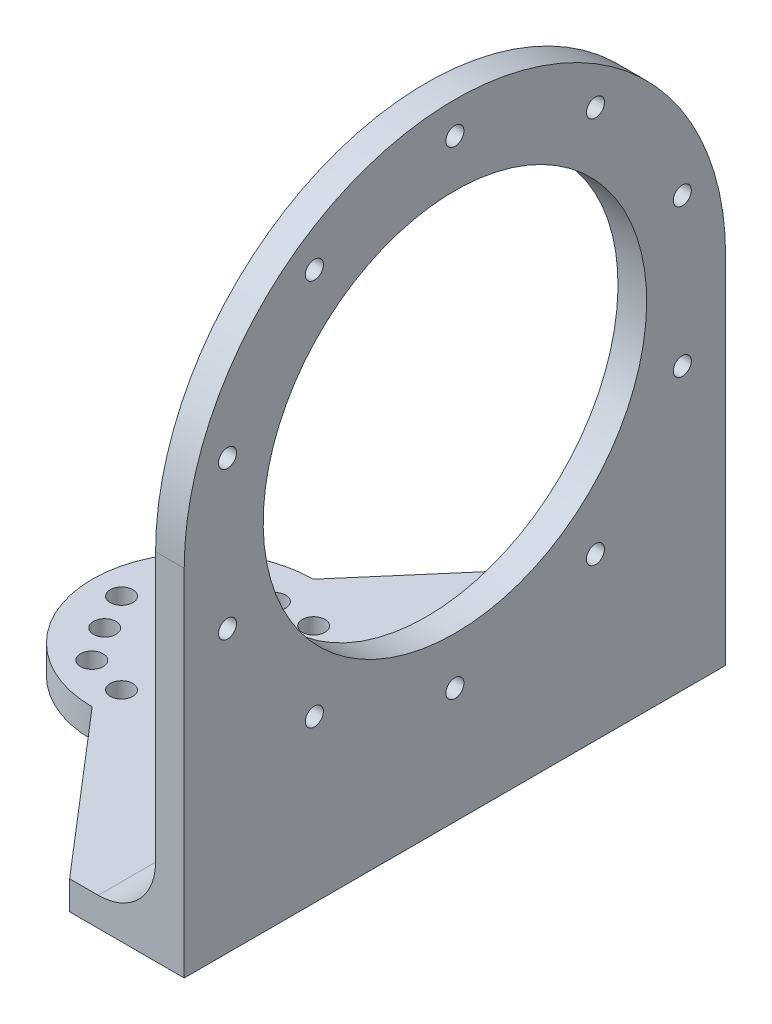
ISO-10303-21;
HEADER;
FILE_DESCRIPTION(('STEP AP214'),'2;1');
FILE_NAME('part.step','',(''),(''),'','','');
FILE_SCHEMA(('AUTOMOTIVE_DESIGN { 1 0 10303 214 1 1 1 1 }'));
ENDSEC;
DATA;
#1=APPLICATION_CONTEXT('core data for automotive mechanical design processes');
#2=APPLICATION_PROTOCOL_DEFINITION('international standard','automotive_design',2000,#1);
#3=PRODUCT_CONTEXT('',#1,'mechanical');
#4=PRODUCT('Part','Part','',(#3));
#5=PRODUCT_RELATED_PRODUCT_CATEGORY('part','',(#4));
#6=PRODUCT_DEFINITION_FORMATION('','',#4);
#7=PRODUCT_DEFINITION_CONTEXT('part definition',#1,'design');
#8=PRODUCT_DEFINITION('design','',#6,#7);
#9=PRODUCT_DEFINITION_SHAPE('','',#8);
#10=(LENGTH_UNIT() NAMED_UNIT(*) SI_UNIT(.MILLI.,.METRE.));
#11=(NAMED_UNIT(*) PLANE_ANGLE_UNIT() SI_UNIT($,.RADIAN.));
#12=(NAMED_UNIT(*) SI_UNIT($,.STERADIAN.) SOLID_ANGLE_UNIT());
#13=UNCERTAINTY_MEASURE_WITH_UNIT(LENGTH_MEASURE(1.E-05),#10,'distance_accuracy_value','');
#14=(GEOMETRIC_REPRESENTATION_CONTEXT(3) GLOBAL_UNCERTAINTY_ASSIGNED_CONTEXT((#13)) GLOBAL_UNIT_ASSIGNED_CONTEXT((#10,
#11,#12)) REPRESENTATION_CONTEXT('',''));
#15=CARTESIAN_POINT('',(0.,0.,0.));
#16=DIRECTION('',(0.,0.,1.));
#17=DIRECTION('',(1.,0.,0.));
#18=AXIS2_PLACEMENT_3D('',#15,#16,#17);
#19=CARTESIAN_POINT('',(47.625,73.025,120.));
#20=DIRECTION('',(0.,0.,-1.));
#21=DIRECTION('',(-1.,0.,0.));
#22=AXIS2_PLACEMENT_3D('',#19,#20,#21);
#23=PLANE('',#22);
#24=DIRECTION('',(-1.,0.,0.));
#25=VECTOR('',#24,1.);
#26=CARTESIAN_POINT('',(191.651206952585,2.45000000000006,120.));
#27=LINE('',#26,#25);
#28=CARTESIAN_POINT('',(50.8,2.45000000000005,120.));
#29=VERTEX_POINT('',#28);
#30=CARTESIAN_POINT('',(44.45,2.45000000000004,120.));
#31=VERTEX_POINT('',#30);
#32=EDGE_CURVE('E121',#29,#31,#27,.T.);
#33=ORIENTED_EDGE('',*,*,#32,.T.);
#34=DIRECTION('',(0.,-1.,0.));
#35=VECTOR('',#34,1.);
#36=CARTESIAN_POINT('',(44.45,73.025,120.));
#37=LINE('',#36,#35);
#38=CARTESIAN_POINT('',(44.45,-57.15,120.));
#39=VERTEX_POINT('',#38);
#40=EDGE_CURVE('E129',#31,#39,#37,.T.);
#41=ORIENTED_EDGE('',*,*,#40,.T.);
#42=CARTESIAN_POINT('',(31.75,-57.15,120.));
#43=DIRECTION('',(0.,0.,-1.));
#44=DIRECTION('',(-1.,0.,0.));
#45=AXIS2_PLACEMENT_3D('',#42,#43,#44);
#46=CIRCLE('',#45,12.7);
#47=CARTESIAN_POINT('',(31.75,-69.85,120.));
#48=VERTEX_POINT('',#47);
#49=EDGE_CURVE('E153',#39,#48,#46,.T.);
#50=ORIENTED_EDGE('',*,*,#49,.T.);
#51=DIRECTION('',(-1.,0.,0.));
#52=VECTOR('',#51,1.);
#53=CARTESIAN_POINT('',(31.75,-69.85,120.));
#54=LINE('',#53,#52);
#55=CARTESIAN_POINT('',(25.4,-69.85,120.));
#56=VERTEX_POINT('',#55);
#57=EDGE_CURVE('E148',#48,#56,#54,.T.);
#58=ORIENTED_EDGE('',*,*,#57,.T.);
#59=DIRECTION('',(0.,1.,0.));
#60=VECTOR('',#59,1.);
#61=CARTESIAN_POINT('',(25.4,-218.349358071009,120.));
#62=LINE('',#61,#60);
#63=CARTESIAN_POINT('',(25.4,-76.2,120.));
#64=VERTEX_POINT('',#63);
#65=EDGE_CURVE('E182',#64,#56,#62,.T.);
#66=ORIENTED_EDGE('',*,*,#65,.F.);
#67=DIRECTION('',(1.,0.,0.));
#68=VECTOR('',#67,1.);
#69=CARTESIAN_POINT('',(-50.8,-76.2,120.));
#70=LINE('',#69,#68);
#71=CARTESIAN_POINT('',(50.8,-76.2,120.));
#72=VERTEX_POINT('',#71);
#73=EDGE_CURVE('E145',#64,#72,#70,.T.);
#74=ORIENTED_EDGE('',*,*,#73,.T.);
#75=DIRECTION('',(0.,1.,0.));
#76=VECTOR('',#75,1.);
#77=CARTESIAN_POINT('',(50.8,-76.2,120.));
#78=LINE('',#77,#76);
#79=EDGE_CURVE('E159',#72,#29,#78,.T.);
#80=ORIENTED_EDGE('',*,*,#79,.T.);
#81=EDGE_LOOP('',(#33,#41,#50,#58,#66,#74,#80));
#82=FACE_BOUND('',#81,.T.);
#83=ADVANCED_FACE('F44',(#82),#23,.F.);
#84=CARTESIAN_POINT('',(47.625,73.025,0.));
#85=DIRECTION('',(0.,0.,-1.));
#86=DIRECTION('',(-1.,0.,0.));
#87=AXIS2_PLACEMENT_3D('',#84,#85,#86);
#88=PLANE('',#87);
#89=DIRECTION('',(0.,-1.,0.));
#90=VECTOR('',#89,1.);
#91=CARTESIAN_POINT('',(44.45,73.025,0.));
#92=LINE('',#91,#90);
#93=CARTESIAN_POINT('',(44.45,2.45000000000004,0.));
#94=VERTEX_POINT('',#93);
#95=CARTESIAN_POINT('',(44.45,-57.15,0.));
#96=VERTEX_POINT('',#95);
#97=EDGE_CURVE('E127',#94,#96,#92,.T.);
#98=ORIENTED_EDGE('',*,*,#97,.F.);
#99=DIRECTION('',(-1.,0.,0.));
#100=VECTOR('',#99,1.);
#101=CARTESIAN_POINT('',(191.651206952585,2.45000000000007,0.));
#102=LINE('',#101,#100);
#103=CARTESIAN_POINT('',(50.8,2.45000000000005,0.));
#104=VERTEX_POINT('',#103);
#105=EDGE_CURVE('E112',#104,#94,#102,.T.);
#106=ORIENTED_EDGE('',*,*,#105,.F.);
#107=DIRECTION('',(0.,1.,0.));
#108=VECTOR('',#107,1.);
#109=CARTESIAN_POINT('',(50.8,-76.2,0.));
#110=LINE('',#109,#108);
#111=CARTESIAN_POINT('',(50.8,-76.2,0.));
#112=VERTEX_POINT('',#111);
#113=EDGE_CURVE('E135',#112,#104,#110,.T.);
#114=ORIENTED_EDGE('',*,*,#113,.F.);
#115=DIRECTION('',(1.,0.,0.));
#116=VECTOR('',#115,1.);
#117=CARTESIAN_POINT('',(-50.8,-76.2,0.));
#118=LINE('',#117,#116);
#119=CARTESIAN_POINT('',(25.4,-76.2,0.));
#120=VERTEX_POINT('',#119);
#121=EDGE_CURVE('E139',#120,#112,#118,.T.);
#122=ORIENTED_EDGE('',*,*,#121,.F.);
#123=DIRECTION('',(0.,1.,0.));
#124=VECTOR('',#123,1.);
#125=CARTESIAN_POINT('',(25.4,-218.349358071009,0.));
#126=LINE('',#125,#124);
#127=CARTESIAN_POINT('',(25.4,-69.85,0.));
#128=VERTEX_POINT('',#127);
#129=EDGE_CURVE('E183',#120,#128,#126,.T.);
#130=ORIENTED_EDGE('',*,*,#129,.T.);
#131=DIRECTION('',(-1.,0.,0.));
#132=VECTOR('',#131,1.);
#133=CARTESIAN_POINT('',(31.75,-69.85,0.));
#134=LINE('',#133,#132);
#135=CARTESIAN_POINT('',(31.75,-69.85,0.));
#136=VERTEX_POINT('',#135);
#137=EDGE_CURVE('E137',#136,#128,#134,.T.);
#138=ORIENTED_EDGE('',*,*,#137,.F.);
#139=CARTESIAN_POINT('',(31.75,-57.15,0.));
#140=DIRECTION('',(0.,0.,-1.));
#141=DIRECTION('',(-1.,0.,0.));
#142=AXIS2_PLACEMENT_3D('',#139,#140,#141);
#143=CIRCLE('',#142,12.7);
#144=EDGE_CURVE('E134',#96,#136,#143,.T.);
#145=ORIENTED_EDGE('',*,*,#144,.F.);
#146=EDGE_LOOP('',(#98,#106,#114,#122,#130,#138,#145));
#147=FACE_BOUND('',#146,.T.);
#148=ADVANCED_FACE('F132',(#147),#88,.T.);
#149=CARTESIAN_POINT('',(-50.8,-76.2,120.));
#150=DIRECTION('',(0.,1.,0.));
#151=DIRECTION('',(-1.,0.,0.));
#152=AXIS2_PLACEMENT_3D('',#149,#150,#151);
#153=PLANE('',#152);
#154=CARTESIAN_POINT('',(-14.0999999999991,-76.2,75.5884572681215));
#155=DIRECTION('',(0.,1.,0.));
#156=DIRECTION('',(-1.,0.,0.));
#157=AXIS2_PLACEMENT_3D('',#154,#155,#156);
#158=CIRCLE('',#157,2.50000000000047);
#159=CARTESIAN_POINT('',(-16.5999999999996,-76.2,75.5884572681215));
#160=VERTEX_POINT('',#159);
#161=EDGE_CURVE('E273',#160,#160,#158,.F.);
#162=ORIENTED_EDGE('',*,*,#161,.F.);
#163=EDGE_LOOP('',(#162));
#164=FACE_BOUND('',#163,.T.);
#165=CARTESIAN_POINT('',(-5.0999999999987,-76.2,78.0000000000009));
#166=DIRECTION('',(0.,1.,0.));
#167=DIRECTION('',(-1.,0.,0.));
#168=AXIS2_PLACEMENT_3D('',#165,#166,#167);
#169=CIRCLE('',#168,2.50000000000032);
#170=CARTESIAN_POINT('',(-7.59999999999901,-76.2,78.0000000000009));
#171=VERTEX_POINT('',#170);
#172=EDGE_CURVE('E298',#171,#171,#169,.F.);
#173=ORIENTED_EDGE('',*,*,#172,.F.);
#174=EDGE_LOOP('',(#173));
#175=FACE_BOUND('',#174,.T.);
#176=CARTESIAN_POINT('',(3.90000000000132,-76.2,75.5884572681199));
#177=DIRECTION('',(0.,1.,0.));
#178=DIRECTION('',(-1.,0.,0.));
#179=AXIS2_PLACEMENT_3D('',#176,#177,#178);
#180=CIRCLE('',#179,2.50000000000035);
#181=CARTESIAN_POINT('',(1.40000000000097,-76.2,75.5884572681199));
#182=VERTEX_POINT('',#181);
#183=EDGE_CURVE('E292',#182,#182,#180,.F.);
#184=ORIENTED_EDGE('',*,*,#183,.F.);
#185=EDGE_LOOP('',(#184));
#186=FACE_BOUND('',#185,.T.);
#187=CARTESIAN_POINT('',(12.9000000000016,-76.2,59.9999999999997));
#188=DIRECTION('',(0.,1.,0.));
#189=DIRECTION('',(-1.,0.,0.));
#190=AXIS2_PLACEMENT_3D('',#187,#188,#189);
#191=CIRCLE('',#190,2.49999999999915);
#192=CARTESIAN_POINT('',(10.4000000000024,-76.2,59.9999999999997));
#193=VERTEX_POINT('',#192);
#194=EDGE_CURVE('E284',#193,#193,#191,.F.);
#195=ORIENTED_EDGE('',*,*,#194,.F.);
#196=EDGE_LOOP('',(#195));
#197=FACE_BOUND('',#196,.T.);
#198=CARTESIAN_POINT('',(3.90000000000003,-76.2,44.4115427318801));
#199=DIRECTION('',(0.,1.,0.));
#200=DIRECTION('',(-1.,0.,0.));
#201=AXIS2_PLACEMENT_3D('',#198,#199,#200);
#202=CIRCLE('',#201,2.5);
#203=CARTESIAN_POINT('',(1.40000000000003,-76.2,44.4115427318801));
#204=VERTEX_POINT('',#203);
#205=EDGE_CURVE('E320',#204,#204,#202,.F.);
#206=ORIENTED_EDGE('',*,*,#205,.F.);
#207=EDGE_LOOP('',(#206));
#208=FACE_BOUND('',#207,.T.);
#209=CARTESIAN_POINT('',(8.66980392017361,-76.2,67.9499999999994));
#210=DIRECTION('',(0.,1.,0.));
#211=DIRECTION('',(-1.,0.,0.));
#212=AXIS2_PLACEMENT_3D('',#209,#210,#211);
#213=CIRCLE('',#212,2.50000000000089);
#214=CARTESIAN_POINT('',(6.16980392017272,-76.2,67.9499999999994));
#215=VERTEX_POINT('',#214);
#216=EDGE_CURVE('E315',#215,#215,#213,.F.);
#217=ORIENTED_EDGE('',*,*,#216,.F.);
#218=EDGE_LOOP('',(#217));
#219=FACE_BOUND('',#218,.T.);
#220=CARTESIAN_POINT('',(-18.8698039201716,-76.2,67.9500000000006));
#221=DIRECTION('',(0.,1.,0.));
#222=DIRECTION('',(-1.,0.,0.));
#223=AXIS2_PLACEMENT_3D('',#220,#221,#222);
#224=CIRCLE('',#223,2.50000000000128);
#225=CARTESIAN_POINT('',(-21.3698039201728,-76.2,67.9500000000006));
#226=VERTEX_POINT('',#225);
#227=EDGE_CURVE('E308',#226,#226,#224,.F.);
#228=ORIENTED_EDGE('',*,*,#227,.F.);
#229=EDGE_LOOP('',(#228));
#230=FACE_BOUND('',#229,.T.);
#231=CARTESIAN_POINT('',(10.4884572681207,-76.2,50.9999999999996));
#232=DIRECTION('',(0.,1.,0.));
#233=DIRECTION('',(-1.,0.,0.));
#234=AXIS2_PLACEMENT_3D('',#231,#232,#233);
#235=CIRCLE('',#234,2.49999999999935);
#236=CARTESIAN_POINT('',(7.98845726812136,-76.2,50.9999999999996));
#237=VERTEX_POINT('',#236);
#238=EDGE_CURVE('E291',#237,#237,#235,.F.);
#239=ORIENTED_EDGE('',*,*,#238,.F.);
#240=EDGE_LOOP('',(#239));
#241=FACE_BOUND('',#240,.T.);
#242=CARTESIAN_POINT('',(-23.0999999999993,-76.2,60.0000000000012));
#243=DIRECTION('',(0.,1.,0.));
#244=DIRECTION('',(-1.,0.,0.));
#245=AXIS2_PLACEMENT_3D('',#242,#243,#244);
#246=CIRCLE('',#245,2.50000000000138);
#247=CARTESIAN_POINT('',(-25.6000000000007,-76.2,60.0000000000012));
#248=VERTEX_POINT('',#247);
#249=EDGE_CURVE('E266',#248,#248,#246,.F.);
#250=ORIENTED_EDGE('',*,*,#249,.F.);
#251=EDGE_LOOP('',(#250));
#252=FACE_BOUND('',#251,.T.);
#253=CARTESIAN_POINT('',(-20.68845726812,-76.2,51.0000000000007));
#254=DIRECTION('',(0.,1.,0.));
#255=DIRECTION('',(-1.,0.,0.));
#256=AXIS2_PLACEMENT_3D('',#253,#254,#255);
#257=CIRCLE('',#256,2.50000000000075);
#258=CARTESIAN_POINT('',(-23.1884572681207,-76.2,51.0000000000007));
#259=VERTEX_POINT('',#258);
#260=EDGE_CURVE('E274',#259,#259,#257,.F.);
#261=ORIENTED_EDGE('',*,*,#260,.F.);
#262=EDGE_LOOP('',(#261));
#263=FACE_BOUND('',#262,.T.);
#264=CARTESIAN_POINT('',(-14.1000000000004,-76.2,44.4115427318801));
#265=DIRECTION('',(0.,1.,0.));
#266=DIRECTION('',(-1.,0.,0.));
#267=AXIS2_PLACEMENT_3D('',#264,#265,#266);
#268=CIRCLE('',#267,2.50000000000025);
#269=CARTESIAN_POINT('',(-16.6000000000007,-76.2,44.4115427318801));
#270=VERTEX_POINT('',#269);
#271=EDGE_CURVE('E265',#270,#270,#268,.F.);
#272=ORIENTED_EDGE('',*,*,#271,.F.);
#273=EDGE_LOOP('',(#272));
#274=FACE_BOUND('',#273,.T.);
#275=CARTESIAN_POINT('',(-5.09999999999999,-76.2,44.1));
#276=DIRECTION('',(0.,1.,0.));
#277=DIRECTION('',(-1.,0.,0.));
#278=AXIS2_PLACEMENT_3D('',#275,#276,#277);
#279=CIRCLE('',#278,2.5);
#280=CARTESIAN_POINT('',(-7.59999999999999,-76.2,44.1));
#281=VERTEX_POINT('',#280);
#282=EDGE_CURVE('E178',#281,#281,#279,.F.);
#283=ORIENTED_EDGE('',*,*,#282,.F.);
#284=EDGE_LOOP('',(#283));
#285=FACE_BOUND('',#284,.T.);
#286=CARTESIAN_POINT('',(-5.09999999999999,-76.2,60.));
#287=DIRECTION('',(0.,1.,0.));
#288=DIRECTION('',(-1.,0.,0.));
#289=AXIS2_PLACEMENT_3D('',#286,#287,#288);
#290=CIRCLE('',#289,24.5);
#291=CARTESIAN_POINT('',(-5.1,-76.2,35.5));
#292=VERTEX_POINT('',#291);
#293=CARTESIAN_POINT('',(-5.09999999999998,-76.2,84.5));
#294=VERTEX_POINT('',#293);
#295=EDGE_CURVE('E167',#292,#294,#290,.T.);
#296=ORIENTED_EDGE('',*,*,#295,.F.);
#297=DIRECTION('',(-0.651670723445816,0.,0.758501989584475));
#298=VECTOR('',#297,1.);
#299=CARTESIAN_POINT('',(-5.1,-76.2,35.5));
#300=LINE('',#299,#298);
#301=EDGE_CURVE('E162',#120,#292,#300,.T.);
#302=ORIENTED_EDGE('',*,*,#301,.F.);
#303=ORIENTED_EDGE('',*,*,#121,.T.);
#304=DIRECTION('',(0.,0.,-1.));
#305=VECTOR('',#304,1.);
#306=CARTESIAN_POINT('',(50.8,-76.2,120.));
#307=LINE('',#306,#305);
#308=EDGE_CURVE('E11',#72,#112,#307,.T.);
#309=ORIENTED_EDGE('',*,*,#308,.F.);
#310=ORIENTED_EDGE('',*,*,#73,.F.);
#311=DIRECTION('',(0.651670723445816,0.,0.758501989584475));
#312=VECTOR('',#311,1.);
#313=CARTESIAN_POINT('',(25.4,-76.2,120.));
#314=LINE('',#313,#312);
#315=EDGE_CURVE('E170',#294,#64,#314,.T.);
#316=ORIENTED_EDGE('',*,*,#315,.F.);
#317=EDGE_LOOP('',(#296,#302,#303,#309,#310,#316));
#318=FACE_BOUND('',#317,.T.);
#319=ADVANCED_FACE('F46',(#164,#175,#186,#197,#208,#219,#230,#241,#252,#263,#274,#285,#318),
#153,.F.);
#320=CARTESIAN_POINT('',(50.8,-76.2,120.));
#321=DIRECTION('',(-1.,0.,0.));
#322=DIRECTION('',(0.,-1.,0.));
#323=AXIS2_PLACEMENT_3D('',#320,#321,#322);
#324=PLANE('',#323);
#325=CARTESIAN_POINT('',(50.8,-13.9279007018952,9.59400463638843));
#326=DIRECTION('',(-1.,0.,0.));
#327=DIRECTION('',(0.,-1.,0.));
#328=AXIS2_PLACEMENT_3D('',#325,#326,#327);
#329=CIRCLE('',#328,2.);
#330=CARTESIAN_POINT('',(50.8,-15.9279007018952,9.59400463638843));
#331=VERTEX_POINT('',#330);
#332=EDGE_CURVE('E208',#331,#331,#329,.F.);
#333=ORIENTED_EDGE('',*,*,#332,.F.);
#334=EDGE_LOOP('',(#333));
#335=FACE_BOUND('',#334,.T.);
#336=CARTESIAN_POINT('',(50.8,-40.4279007018864,28.8473816285426));
#337=DIRECTION('',(-1.,0.,0.));
#338=DIRECTION('',(0.,-1.,0.));
#339=AXIS2_PLACEMENT_3D('',#336,#337,#338);
#340=CIRCLE('',#339,2.);
#341=CARTESIAN_POINT('',(50.8,-42.4279007018864,28.8473816285426));
#342=VERTEX_POINT('',#341);
#343=EDGE_CURVE('E226',#342,#342,#340,.F.);
#344=ORIENTED_EDGE('',*,*,#343,.F.);
#345=EDGE_LOOP('',(#344));
#346=FACE_BOUND('',#345,.T.);
#347=CARTESIAN_POINT('',(50.8,-50.5499999999999,60.0000000000483));
#348=DIRECTION('',(-1.,0.,0.));
#349=DIRECTION('',(0.,-1.,0.));
#350=AXIS2_PLACEMENT_3D('',#347,#348,#349);
#351=CIRCLE('',#350,2.);
#352=CARTESIAN_POINT('',(50.8,-52.5499999999999,60.0000000000483));
#353=VERTEX_POINT('',#352);
#354=EDGE_CURVE('E220',#353,#353,#351,.F.);
#355=ORIENTED_EDGE('',*,*,#354,.F.);
#356=EDGE_LOOP('',(#355));
#357=FACE_BOUND('',#356,.T.);
#358=CARTESIAN_POINT('',(50.8,-40.4279007018579,91.1526183715447));
#359=DIRECTION('',(-1.,0.,0.));
#360=DIRECTION('',(0.,-1.,0.));
#361=AXIS2_PLACEMENT_3D('',#358,#359,#360);
#362=CIRCLE('',#361,2.00000000000004);
#363=CARTESIAN_POINT('',(50.8,-42.427900701858,91.1526183715447));
#364=VERTEX_POINT('',#363);
#365=EDGE_CURVE('E212',#364,#364,#362,.F.);
#366=ORIENTED_EDGE('',*,*,#365,.F.);
#367=EDGE_LOOP('',(#366));
#368=FACE_BOUND('',#367,.T.);
#369=CARTESIAN_POINT('',(50.8,-13.9279007018492,110.405995363675));
#370=DIRECTION('',(-1.,0.,0.));
#371=DIRECTION('',(0.,-1.,0.));
#372=AXIS2_PLACEMENT_3D('',#369,#370,#371);
#373=CIRCLE('',#372,2.);
#374=CARTESIAN_POINT('',(50.8,-15.9279007018492,110.405995363675));
#375=VERTEX_POINT('',#374);
#376=EDGE_CURVE('E219',#375,#375,#373,.F.);
#377=ORIENTED_EDGE('',*,*,#376,.F.);
#378=EDGE_LOOP('',(#377));
#379=FACE_BOUND('',#378,.T.);
#380=CARTESIAN_POINT('',(50.8,18.8279007018953,110.40599536366));
#381=DIRECTION('',(-1.,0.,0.));
#382=DIRECTION('',(0.,-1.,0.));
#383=AXIS2_PLACEMENT_3D('',#380,#381,#382);
#384=CIRCLE('',#383,2.);
#385=CARTESIAN_POINT('',(50.8,16.8279007018953,110.40599536366));
#386=VERTEX_POINT('',#385);
#387=EDGE_CURVE('E250',#386,#386,#384,.F.);
#388=ORIENTED_EDGE('',*,*,#387,.F.);
#389=EDGE_LOOP('',(#388));
#390=FACE_BOUND('',#389,.T.);
#391=CARTESIAN_POINT('',(50.8,45.3279007018864,91.1526183715056));
#392=DIRECTION('',(-1.,0.,0.));
#393=DIRECTION('',(0.,-1.,0.));
#394=AXIS2_PLACEMENT_3D('',#391,#392,#393);
#395=CIRCLE('',#394,2.);
#396=CARTESIAN_POINT('',(50.8,43.3279007018865,91.1526183715056));
#397=VERTEX_POINT('',#396);
#398=EDGE_CURVE('E244',#397,#397,#395,.F.);
#399=ORIENTED_EDGE('',*,*,#398,.F.);
#400=EDGE_LOOP('',(#399));
#401=FACE_BOUND('',#400,.T.);
#402=CARTESIAN_POINT('',(50.8,55.45,59.9999999999999));
#403=DIRECTION('',(-1.,0.,0.));
#404=DIRECTION('',(0.,-1.,0.));
#405=AXIS2_PLACEMENT_3D('',#402,#403,#404);
#406=CIRCLE('',#405,2.);
#407=CARTESIAN_POINT('',(50.8,53.4500000000001,59.9999999999999));
#408=VERTEX_POINT('',#407);
#409=EDGE_CURVE('E236',#408,#408,#406,.F.);
#410=ORIENTED_EDGE('',*,*,#409,.F.);
#411=EDGE_LOOP('',(#410));
#412=FACE_BOUND('',#411,.T.);
#413=CARTESIAN_POINT('',(50.8,18.8279007018492,9.59400463637344));
#414=DIRECTION('',(-1.,0.,0.));
#415=DIRECTION('',(0.,-1.,0.));
#416=AXIS2_PLACEMENT_3D('',#413,#414,#415);
#417=CIRCLE('',#416,2.00000000000005);
#418=CARTESIAN_POINT('',(50.8,16.8279007018492,9.59400463637344));
#419=VERTEX_POINT('',#418);
#420=EDGE_CURVE('E203',#419,#419,#417,.F.);
#421=ORIENTED_EDGE('',*,*,#420,.F.);
#422=EDGE_LOOP('',(#421));
#423=FACE_BOUND('',#422,.T.);
#424=CARTESIAN_POINT('',(50.8,45.327900701858,28.8473816285034));
#425=DIRECTION('',(-1.,0.,0.));
#426=DIRECTION('',(0.,-1.,0.));
#427=AXIS2_PLACEMENT_3D('',#424,#425,#426);
#428=CIRCLE('',#427,2.);
#429=CARTESIAN_POINT('',(50.8,43.327900701858,28.8473816285034));
#430=VERTEX_POINT('',#429);
#431=EDGE_CURVE('E196',#430,#430,#428,.F.);
#432=ORIENTED_EDGE('',*,*,#431,.F.);
#433=EDGE_LOOP('',(#432));
#434=FACE_BOUND('',#433,.T.);
#435=CARTESIAN_POINT('',(50.8,2.45000000000004,59.9999999999999));
#436=DIRECTION('',(-1.,0.,0.));
#437=DIRECTION('',(0.,-1.,0.));
#438=AXIS2_PLACEMENT_3D('',#435,#436,#437);
#439=CIRCLE('',#438,42.5);
#440=CARTESIAN_POINT('',(50.8,-40.05,59.9999999999999));
#441=VERTEX_POINT('',#440);
#442=EDGE_CURVE('E262',#441,#441,#439,.F.);
#443=ORIENTED_EDGE('',*,*,#442,.F.);
#444=EDGE_LOOP('',(#443));
#445=FACE_BOUND('',#444,.T.);
#446=ORIENTED_EDGE('',*,*,#113,.T.);
#447=CARTESIAN_POINT('',(50.8,2.45000000000004,59.9999999999999));
#448=DIRECTION('',(-1.,0.,0.));
#449=DIRECTION('',(0.,-1.,0.));
#450=AXIS2_PLACEMENT_3D('',#447,#448,#449);
#451=CIRCLE('',#450,60.);
#452=EDGE_CURVE('E59',#29,#104,#451,.T.);
#453=ORIENTED_EDGE('',*,*,#452,.F.);
#454=ORIENTED_EDGE('',*,*,#79,.F.);
#455=ORIENTED_EDGE('',*,*,#308,.T.);
#456=EDGE_LOOP('',(#446,#453,#454,#455));
#457=FACE_BOUND('',#456,.T.);
#458=ADVANCED_FACE('F195',(#335,#346,#357,#368,#379,#390,#401,#412,#423,#434,#445,#457),#324,.F.);
#459=CARTESIAN_POINT('',(44.45,73.025,120.));
#460=DIRECTION('',(1.,0.,0.));
#461=DIRECTION('',(0.,1.,0.));
#462=AXIS2_PLACEMENT_3D('',#459,#460,#461);
#463=PLANE('',#462);
#464=CARTESIAN_POINT('',(44.45,-13.9279007018952,9.59400463638843));
#465=DIRECTION('',(-1.,0.,0.));
#466=DIRECTION('',(0.,-1.,0.));
#467=AXIS2_PLACEMENT_3D('',#464,#465,#466);
#468=CIRCLE('',#467,2.);
#469=CARTESIAN_POINT('',(44.45,-15.9279007018952,9.59400463638843));
#470=VERTEX_POINT('',#469);
#471=EDGE_CURVE('E229',#470,#470,#468,.T.);
#472=ORIENTED_EDGE('',*,*,#471,.F.);
#473=EDGE_LOOP('',(#472));
#474=FACE_BOUND('',#473,.T.);
#475=CARTESIAN_POINT('',(44.45,-40.4279007018864,28.8473816285426));
#476=DIRECTION('',(-1.,0.,0.));
#477=DIRECTION('',(0.,-1.,0.));
#478=AXIS2_PLACEMENT_3D('',#475,#476,#477);
#479=CIRCLE('',#478,2.);
#480=CARTESIAN_POINT('',(44.45,-42.4279007018864,28.8473816285426));
#481=VERTEX_POINT('',#480);
#482=EDGE_CURVE('E223',#481,#481,#479,.T.);
#483=ORIENTED_EDGE('',*,*,#482,.F.);
#484=EDGE_LOOP('',(#483));
#485=FACE_BOUND('',#484,.T.);
#486=CARTESIAN_POINT('',(44.45,-50.5499999999999,60.0000000000483));
#487=DIRECTION('',(-1.,0.,0.));
#488=DIRECTION('',(0.,-1.,0.));
#489=AXIS2_PLACEMENT_3D('',#486,#487,#488);
#490=CIRCLE('',#489,2.);
#491=CARTESIAN_POINT('',(44.45,-52.5499999999999,60.0000000000483));
#492=VERTEX_POINT('',#491);
#493=EDGE_CURVE('E216',#492,#492,#490,.T.);
#494=ORIENTED_EDGE('',*,*,#493,.F.);
#495=EDGE_LOOP('',(#494));
#496=FACE_BOUND('',#495,.T.);
#497=CARTESIAN_POINT('',(44.45,-40.4279007018579,91.1526183715447));
#498=DIRECTION('',(-1.,0.,0.));
#499=DIRECTION('',(0.,-1.,0.));
#500=AXIS2_PLACEMENT_3D('',#497,#498,#499);
#501=CIRCLE('',#500,2.00000000000004);
#502=CARTESIAN_POINT('',(44.45,-42.427900701858,91.1526183715447));
#503=VERTEX_POINT('',#502);
#504=EDGE_CURVE('E215',#503,#503,#501,.T.);
#505=ORIENTED_EDGE('',*,*,#504,.F.);
#506=EDGE_LOOP('',(#505));
#507=FACE_BOUND('',#506,.T.);
#508=CARTESIAN_POINT('',(44.45,-13.9279007018492,110.405995363675));
#509=DIRECTION('',(-1.,0.,0.));
#510=DIRECTION('',(0.,-1.,0.));
#511=AXIS2_PLACEMENT_3D('',#508,#509,#510);
#512=CIRCLE('',#511,2.);
#513=CARTESIAN_POINT('',(44.45,-15.9279007018492,110.405995363675));
#514=VERTEX_POINT('',#513);
#515=EDGE_CURVE('E253',#514,#514,#512,.T.);
#516=ORIENTED_EDGE('',*,*,#515,.F.);
#517=EDGE_LOOP('',(#516));
#518=FACE_BOUND('',#517,.T.);
#519=CARTESIAN_POINT('',(44.45,18.8279007018953,110.40599536366));
#520=DIRECTION('',(-1.,0.,0.));
#521=DIRECTION('',(0.,-1.,0.));
#522=AXIS2_PLACEMENT_3D('',#519,#520,#521);
#523=CIRCLE('',#522,2.);
#524=CARTESIAN_POINT('',(44.45,16.8279007018953,110.40599536366));
#525=VERTEX_POINT('',#524);
#526=EDGE_CURVE('E247',#525,#525,#523,.T.);
#527=ORIENTED_EDGE('',*,*,#526,.F.);
#528=EDGE_LOOP('',(#527));
#529=FACE_BOUND('',#528,.T.);
#530=CARTESIAN_POINT('',(44.45,45.3279007018864,91.1526183715056));
#531=DIRECTION('',(-1.,0.,0.));
#532=DIRECTION('',(0.,-1.,0.));
#533=AXIS2_PLACEMENT_3D('',#530,#531,#532);
#534=CIRCLE('',#533,2.);
#535=CARTESIAN_POINT('',(44.45,43.3279007018865,91.1526183715056));
#536=VERTEX_POINT('',#535);
#537=EDGE_CURVE('E240',#536,#536,#534,.T.);
#538=ORIENTED_EDGE('',*,*,#537,.F.);
#539=EDGE_LOOP('',(#538));
#540=FACE_BOUND('',#539,.T.);
#541=CARTESIAN_POINT('',(44.45,55.45,59.9999999999999));
#542=DIRECTION('',(-1.,0.,0.));
#543=DIRECTION('',(0.,-1.,0.));
#544=AXIS2_PLACEMENT_3D('',#541,#542,#543);
#545=CIRCLE('',#544,2.);
#546=CARTESIAN_POINT('',(44.45,53.4500000000001,59.9999999999999));
#547=VERTEX_POINT('',#546);
#548=EDGE_CURVE('E239',#547,#547,#545,.T.);
#549=ORIENTED_EDGE('',*,*,#548,.F.);
#550=EDGE_LOOP('',(#549));
#551=FACE_BOUND('',#550,.T.);
#552=CARTESIAN_POINT('',(44.45,18.8279007018492,9.59400463637344));
#553=DIRECTION('',(-1.,0.,0.));
#554=DIRECTION('',(0.,-1.,0.));
#555=AXIS2_PLACEMENT_3D('',#552,#553,#554);
#556=CIRCLE('',#555,2.00000000000005);
#557=CARTESIAN_POINT('',(44.45,16.8279007018492,9.59400463637344));
#558=VERTEX_POINT('',#557);
#559=EDGE_CURVE('E206',#558,#558,#556,.T.);
#560=ORIENTED_EDGE('',*,*,#559,.F.);
#561=EDGE_LOOP('',(#560));
#562=FACE_BOUND('',#561,.T.);
#563=CARTESIAN_POINT('',(44.45,45.327900701858,28.8473816285034));
#564=DIRECTION('',(-1.,0.,0.));
#565=DIRECTION('',(0.,-1.,0.));
#566=AXIS2_PLACEMENT_3D('',#563,#564,#565);
#567=CIRCLE('',#566,2.);
#568=CARTESIAN_POINT('',(44.45,43.327900701858,28.8473816285034));
#569=VERTEX_POINT('',#568);
#570=EDGE_CURVE('E199',#569,#569,#567,.T.);
#571=ORIENTED_EDGE('',*,*,#570,.F.);
#572=EDGE_LOOP('',(#571));
#573=FACE_BOUND('',#572,.T.);
#574=CARTESIAN_POINT('',(44.45,2.45000000000004,59.9999999999999));
#575=DIRECTION('',(-1.,0.,0.));
#576=DIRECTION('',(0.,-1.,0.));
#577=AXIS2_PLACEMENT_3D('',#574,#575,#576);
#578=CIRCLE('',#577,42.5);
#579=CARTESIAN_POINT('',(44.45,-40.05,59.9999999999999));
#580=VERTEX_POINT('',#579);
#581=EDGE_CURVE('E243',#580,#580,#578,.T.);
#582=ORIENTED_EDGE('',*,*,#581,.F.);
#583=EDGE_LOOP('',(#582));
#584=FACE_BOUND('',#583,.T.);
#585=ORIENTED_EDGE('',*,*,#40,.F.);
#586=CARTESIAN_POINT('',(44.45,2.45000000000004,59.9999999999999));
#587=DIRECTION('',(1.,0.,0.));
#588=DIRECTION('',(0.,-1.,0.));
#589=AXIS2_PLACEMENT_3D('',#586,#587,#588);
#590=CIRCLE('',#589,60.);
#591=EDGE_CURVE('E115',#94,#31,#590,.T.);
#592=ORIENTED_EDGE('',*,*,#591,.F.);
#593=ORIENTED_EDGE('',*,*,#97,.T.);
#594=DIRECTION('',(0.,0.,-1.));
#595=VECTOR('',#594,1.);
#596=CARTESIAN_POINT('',(44.45,-57.15,120.));
#597=LINE('',#596,#595);
#598=EDGE_CURVE('E52',#39,#96,#597,.T.);
#599=ORIENTED_EDGE('',*,*,#598,.F.);
#600=EDGE_LOOP('',(#585,#592,#593,#599));
#601=FACE_BOUND('',#600,.T.);
#602=ADVANCED_FACE('F125',(#474,#485,#496,#507,#518,#529,#540,#551,#562,#573,#584,#601),#463,.F.);
#603=CARTESIAN_POINT('',(31.75,-57.15,120.));
#604=DIRECTION('',(0.,0.,-1.));
#605=DIRECTION('',(-1.,0.,0.));
#606=AXIS2_PLACEMENT_3D('',#603,#604,#605);
#607=CYLINDRICAL_SURFACE('',#606,12.7);
#608=ORIENTED_EDGE('',*,*,#144,.T.);
#609=DIRECTION('',(0.,0.,-1.));
#610=VECTOR('',#609,1.);
#611=CARTESIAN_POINT('',(31.75,-69.85,120.));
#612=LINE('',#611,#610);
#613=EDGE_CURVE('E146',#48,#136,#612,.T.);
#614=ORIENTED_EDGE('',*,*,#613,.F.);
#615=ORIENTED_EDGE('',*,*,#49,.F.);
#616=ORIENTED_EDGE('',*,*,#598,.T.);
#617=EDGE_LOOP('',(#608,#614,#615,#616));
#618=FACE_BOUND('',#617,.T.);
#619=ADVANCED_FACE('F151',(#618),#607,.F.);
#620=CARTESIAN_POINT('',(31.75,-69.85,120.));
#621=DIRECTION('',(0.,-1.,0.));
#622=DIRECTION('',(1.,0.,0.));
#623=AXIS2_PLACEMENT_3D('',#620,#621,#622);
#624=PLANE('',#623);
#625=CARTESIAN_POINT('',(-14.0999999999991,-69.85,75.5884572681215));
#626=DIRECTION('',(0.,1.,0.));
#627=DIRECTION('',(-1.,0.,0.));
#628=AXIS2_PLACEMENT_3D('',#625,#626,#627);
#629=CIRCLE('',#628,2.50000000000047);
#630=CARTESIAN_POINT('',(-16.5999999999996,-69.85,75.5884572681215));
#631=VERTEX_POINT('',#630);
#632=EDGE_CURVE('E301',#631,#631,#629,.T.);
#633=ORIENTED_EDGE('',*,*,#632,.F.);
#634=EDGE_LOOP('',(#633));
#635=FACE_BOUND('',#634,.T.);
#636=CARTESIAN_POINT('',(-5.09999999999869,-69.85,78.0000000000009));
#637=DIRECTION('',(0.,1.,0.));
#638=DIRECTION('',(-1.,0.,0.));
#639=AXIS2_PLACEMENT_3D('',#636,#637,#638);
#640=CIRCLE('',#639,2.50000000000032);
#641=CARTESIAN_POINT('',(-7.59999999999901,-69.85,78.0000000000009));
#642=VERTEX_POINT('',#641);
#643=EDGE_CURVE('E295',#642,#642,#640,.T.);
#644=ORIENTED_EDGE('',*,*,#643,.F.);
#645=EDGE_LOOP('',(#644));
#646=FACE_BOUND('',#645,.T.);
#647=CARTESIAN_POINT('',(3.90000000000132,-69.85,75.5884572681199));
#648=DIRECTION('',(0.,1.,0.));
#649=DIRECTION('',(-1.,0.,0.));
#650=AXIS2_PLACEMENT_3D('',#647,#648,#649);
#651=CIRCLE('',#650,2.50000000000035);
#652=CARTESIAN_POINT('',(1.40000000000097,-69.85,75.5884572681199));
#653=VERTEX_POINT('',#652);
#654=EDGE_CURVE('E288',#653,#653,#651,.T.);
#655=ORIENTED_EDGE('',*,*,#654,.F.);
#656=EDGE_LOOP('',(#655));
#657=FACE_BOUND('',#656,.T.);
#658=CARTESIAN_POINT('',(12.9000000000016,-69.85,59.9999999999997));
#659=DIRECTION('',(0.,1.,0.));
#660=DIRECTION('',(-1.,0.,0.));
#661=AXIS2_PLACEMENT_3D('',#658,#659,#660);
#662=CIRCLE('',#661,2.49999999999915);
#663=CARTESIAN_POINT('',(10.4000000000024,-69.85,59.9999999999997));
#664=VERTEX_POINT('',#663);
#665=EDGE_CURVE('E287',#664,#664,#662,.T.);
#666=ORIENTED_EDGE('',*,*,#665,.F.);
#667=EDGE_LOOP('',(#666));
#668=FACE_BOUND('',#667,.T.);
#669=CARTESIAN_POINT('',(3.90000000000003,-69.85,44.4115427318801));
#670=DIRECTION('',(0.,1.,0.));
#671=DIRECTION('',(-1.,0.,0.));
#672=AXIS2_PLACEMENT_3D('',#669,#670,#671);
#673=CIRCLE('',#672,2.5);
#674=CARTESIAN_POINT('',(1.40000000000003,-69.85,44.4115427318801));
#675=VERTEX_POINT('',#674);
#676=EDGE_CURVE('E323',#675,#675,#673,.T.);
#677=ORIENTED_EDGE('',*,*,#676,.F.);
#678=EDGE_LOOP('',(#677));
#679=FACE_BOUND('',#678,.T.);
#680=CARTESIAN_POINT('',(8.66980392017361,-69.85,67.9499999999994));
#681=DIRECTION('',(0.,1.,0.));
#682=DIRECTION('',(-1.,0.,0.));
#683=AXIS2_PLACEMENT_3D('',#680,#681,#682);
#684=CIRCLE('',#683,2.50000000000089);
#685=CARTESIAN_POINT('',(6.16980392017272,-69.85,67.9499999999994));
#686=VERTEX_POINT('',#685);
#687=EDGE_CURVE('E324',#686,#686,#684,.T.);
#688=ORIENTED_EDGE('',*,*,#687,.F.);
#689=EDGE_LOOP('',(#688));
#690=FACE_BOUND('',#689,.T.);
#691=CARTESIAN_POINT('',(-18.8698039201715,-69.85,67.9500000000006));
#692=DIRECTION('',(0.,1.,0.));
#693=DIRECTION('',(-1.,0.,0.));
#694=AXIS2_PLACEMENT_3D('',#691,#692,#693);
#695=CIRCLE('',#694,2.50000000000128);
#696=CARTESIAN_POINT('',(-21.3698039201728,-69.85,67.9500000000006));
#697=VERTEX_POINT('',#696);
#698=EDGE_CURVE('E311',#697,#697,#695,.T.);
#699=ORIENTED_EDGE('',*,*,#698,.F.);
#700=EDGE_LOOP('',(#699));
#701=FACE_BOUND('',#700,.T.);
#702=CARTESIAN_POINT('',(10.4884572681207,-69.85,50.9999999999996));
#703=DIRECTION('',(0.,1.,0.));
#704=DIRECTION('',(-1.,0.,0.));
#705=AXIS2_PLACEMENT_3D('',#702,#703,#704);
#706=CIRCLE('',#705,2.49999999999935);
#707=CARTESIAN_POINT('',(7.98845726812136,-69.85,50.9999999999996));
#708=VERTEX_POINT('',#707);
#709=EDGE_CURVE('E312',#708,#708,#706,.T.);
#710=ORIENTED_EDGE('',*,*,#709,.F.);
#711=EDGE_LOOP('',(#710));
#712=FACE_BOUND('',#711,.T.);
#713=CARTESIAN_POINT('',(-23.0999999999993,-69.85,60.0000000000012));
#714=DIRECTION('',(0.,1.,0.));
#715=DIRECTION('',(-1.,0.,0.));
#716=AXIS2_PLACEMENT_3D('',#713,#714,#715);
#717=CIRCLE('',#716,2.50000000000138);
#718=CARTESIAN_POINT('',(-25.6000000000007,-69.85,60.0000000000012));
#719=VERTEX_POINT('',#718);
#720=EDGE_CURVE('E269',#719,#719,#717,.T.);
#721=ORIENTED_EDGE('',*,*,#720,.F.);
#722=EDGE_LOOP('',(#721));
#723=FACE_BOUND('',#722,.T.);
#724=CARTESIAN_POINT('',(-20.68845726812,-69.85,51.0000000000007));
#725=DIRECTION('',(0.,1.,0.));
#726=DIRECTION('',(-1.,0.,0.));
#727=AXIS2_PLACEMENT_3D('',#724,#725,#726);
#728=CIRCLE('',#727,2.50000000000075);
#729=CARTESIAN_POINT('',(-23.1884572681207,-69.85,51.0000000000007));
#730=VERTEX_POINT('',#729);
#731=EDGE_CURVE('E270',#730,#730,#728,.T.);
#732=ORIENTED_EDGE('',*,*,#731,.F.);
#733=EDGE_LOOP('',(#732));
#734=FACE_BOUND('',#733,.T.);
#735=CARTESIAN_POINT('',(-14.1000000000004,-69.85,44.4115427318801));
#736=DIRECTION('',(0.,1.,0.));
#737=DIRECTION('',(-1.,0.,0.));
#738=AXIS2_PLACEMENT_3D('',#735,#736,#737);
#739=CIRCLE('',#738,2.50000000000025);
#740=CARTESIAN_POINT('',(-16.6000000000007,-69.85,44.4115427318801));
#741=VERTEX_POINT('',#740);
#742=EDGE_CURVE('E277',#741,#741,#739,.T.);
#743=ORIENTED_EDGE('',*,*,#742,.F.);
#744=EDGE_LOOP('',(#743));
#745=FACE_BOUND('',#744,.T.);
#746=CARTESIAN_POINT('',(-5.09999999999998,-69.85,44.1));
#747=DIRECTION('',(0.,1.,0.));
#748=DIRECTION('',(-1.,0.,0.));
#749=AXIS2_PLACEMENT_3D('',#746,#747,#748);
#750=CIRCLE('',#749,2.5);
#751=CARTESIAN_POINT('',(-7.59999999999999,-69.85,44.1));
#752=VERTEX_POINT('',#751);
#753=EDGE_CURVE('E327',#752,#752,#750,.T.);
#754=ORIENTED_EDGE('',*,*,#753,.F.);
#755=EDGE_LOOP('',(#754));
#756=FACE_BOUND('',#755,.T.);
#757=ORIENTED_EDGE('',*,*,#137,.T.);
#758=DIRECTION('',(0.651670723445816,0.,-0.758501989584475));
#759=VECTOR('',#758,1.);
#760=CARTESIAN_POINT('',(-5.09999999999998,-69.85,35.5));
#761=LINE('',#760,#759);
#762=CARTESIAN_POINT('',(-5.09999999999998,-69.85,35.5));
#763=VERTEX_POINT('',#762);
#764=EDGE_CURVE('E67',#763,#128,#761,.T.);
#765=ORIENTED_EDGE('',*,*,#764,.F.);
#766=CARTESIAN_POINT('',(-5.09999999999998,-69.85,60.));
#767=DIRECTION('',(0.,-1.,0.));
#768=DIRECTION('',(-1.,0.,0.));
#769=AXIS2_PLACEMENT_3D('',#766,#767,#768);
#770=CIRCLE('',#769,24.5);
#771=CARTESIAN_POINT('',(-5.09999999999999,-69.85,84.5));
#772=VERTEX_POINT('',#771);
#773=EDGE_CURVE('E177',#772,#763,#770,.T.);
#774=ORIENTED_EDGE('',*,*,#773,.F.);
#775=DIRECTION('',(-0.651670723445816,0.,-0.758501989584475));
#776=VECTOR('',#775,1.);
#777=CARTESIAN_POINT('',(25.4,-69.85,120.));
#778=LINE('',#777,#776);
#779=EDGE_CURVE('E174',#56,#772,#778,.T.);
#780=ORIENTED_EDGE('',*,*,#779,.F.);
#781=ORIENTED_EDGE('',*,*,#57,.F.);
#782=ORIENTED_EDGE('',*,*,#613,.T.);
#783=EDGE_LOOP('',(#757,#765,#774,#780,#781,#782));
#784=FACE_BOUND('',#783,.T.);
#785=ADVANCED_FACE('F358',(#635,#646,#657,#668,#679,#690,#701,#712,#723,#734,#745,#756,#784),
#624,.F.);
#786=CARTESIAN_POINT('',(-5.10000000000001,-218.349358071009,35.5));
#787=DIRECTION('',(0.758501989584475,0.,0.651670723445816));
#788=DIRECTION('',(0.651670723445816,0.,-0.758501989584475));
#789=AXIS2_PLACEMENT_3D('',#786,#787,#788);
#790=PLANE('',#789);
#791=ORIENTED_EDGE('',*,*,#301,.T.);
#792=DIRECTION('',(0.,1.,0.));
#793=VECTOR('',#792,1.);
#794=CARTESIAN_POINT('',(-5.10000000000001,-218.349358071009,35.5));
#795=LINE('',#794,#793);
#796=EDGE_CURVE('E185',#292,#763,#795,.T.);
#797=ORIENTED_EDGE('',*,*,#796,.T.);
#798=ORIENTED_EDGE('',*,*,#764,.T.);
#799=ORIENTED_EDGE('',*,*,#129,.F.);
#800=EDGE_LOOP('',(#791,#797,#798,#799));
#801=FACE_BOUND('',#800,.T.);
#802=ADVANCED_FACE('F361',(#801),#790,.F.);
#803=CARTESIAN_POINT('',(-5.10000000000001,-218.349358071009,60.));
#804=DIRECTION('',(0.,1.,0.));
#805=DIRECTION('',(-1.,0.,0.));
#806=AXIS2_PLACEMENT_3D('',#803,#804,#805);
#807=CYLINDRICAL_SURFACE('',#806,24.5);
#808=ORIENTED_EDGE('',*,*,#295,.T.);
#809=DIRECTION('',(0.,1.,0.));
#810=VECTOR('',#809,1.);
#811=CARTESIAN_POINT('',(-5.10000000000001,-218.349358071009,84.5));
#812=LINE('',#811,#810);
#813=EDGE_CURVE('E187',#294,#772,#812,.T.);
#814=ORIENTED_EDGE('',*,*,#813,.T.);
#815=ORIENTED_EDGE('',*,*,#773,.T.);
#816=ORIENTED_EDGE('',*,*,#796,.F.);
#817=EDGE_LOOP('',(#808,#814,#815,#816));
#818=FACE_BOUND('',#817,.T.);
#819=ADVANCED_FACE('F455',(#818),#807,.T.);
#820=CARTESIAN_POINT('',(25.4,-218.349358071009,120.));
#821=DIRECTION('',(0.758501989584475,0.,-0.651670723445816));
#822=DIRECTION('',(-0.651670723445816,0.,-0.758501989584475));
#823=AXIS2_PLACEMENT_3D('',#820,#821,#822);
#824=PLANE('',#823);
#825=ORIENTED_EDGE('',*,*,#315,.T.);
#826=ORIENTED_EDGE('',*,*,#65,.T.);
#827=ORIENTED_EDGE('',*,*,#779,.T.);
#828=ORIENTED_EDGE('',*,*,#813,.F.);
#829=EDGE_LOOP('',(#825,#826,#827,#828));
#830=FACE_BOUND('',#829,.T.);
#831=ADVANCED_FACE('F338',(#830),#824,.F.);
#832=CARTESIAN_POINT('',(-5.09999999999999,-83.2710678118694,44.1));
#833=DIRECTION('',(0.,1.,0.));
#834=DIRECTION('',(-1.,0.,0.));
#835=AXIS2_PLACEMENT_3D('',#832,#833,#834);
#836=CYLINDRICAL_SURFACE('',#835,2.5);
#837=ORIENTED_EDGE('',*,*,#282,.T.);
#838=EDGE_LOOP('',(#837));
#839=FACE_BOUND('',#838,.T.);
#840=ORIENTED_EDGE('',*,*,#753,.T.);
#841=EDGE_LOOP('',(#840));
#842=FACE_BOUND('',#841,.T.);
#843=ADVANCED_FACE('F423',(#839,#842),#836,.F.);
#844=CARTESIAN_POINT('',(-14.1000000000004,-83.2710678118694,44.4115427318801));
#845=DIRECTION('',(0.,1.,0.));
#846=DIRECTION('',(-1.,0.,0.));
#847=AXIS2_PLACEMENT_3D('',#844,#845,#846);
#848=CYLINDRICAL_SURFACE('',#847,2.50000000000025);
#849=ORIENTED_EDGE('',*,*,#271,.T.);
#850=EDGE_LOOP('',(#849));
#851=FACE_BOUND('',#850,.T.);
#852=ORIENTED_EDGE('',*,*,#742,.T.);
#853=EDGE_LOOP('',(#852));
#854=FACE_BOUND('',#853,.T.);
#855=ADVANCED_FACE('F419',(#851,#854),#848,.F.);
#856=CARTESIAN_POINT('',(-20.68845726812,-83.2710678118694,51.0000000000007));
#857=DIRECTION('',(0.,1.,0.));
#858=DIRECTION('',(-1.,0.,0.));
#859=AXIS2_PLACEMENT_3D('',#856,#857,#858);
#860=CYLINDRICAL_SURFACE('',#859,2.50000000000075);
#861=ORIENTED_EDGE('',*,*,#260,.T.);
#862=EDGE_LOOP('',(#861));
#863=FACE_BOUND('',#862,.T.);
#864=ORIENTED_EDGE('',*,*,#731,.T.);
#865=EDGE_LOOP('',(#864));
#866=FACE_BOUND('',#865,.T.);
#867=ADVANCED_FACE('F415',(#863,#866),#860,.F.);
#868=CARTESIAN_POINT('',(-23.0999999999993,-83.2710678118694,60.0000000000012));
#869=DIRECTION('',(0.,1.,0.));
#870=DIRECTION('',(-1.,0.,0.));
#871=AXIS2_PLACEMENT_3D('',#868,#869,#870);
#872=CYLINDRICAL_SURFACE('',#871,2.50000000000138);
#873=ORIENTED_EDGE('',*,*,#249,.T.);
#874=EDGE_LOOP('',(#873));
#875=FACE_BOUND('',#874,.T.);
#876=ORIENTED_EDGE('',*,*,#720,.T.);
#877=EDGE_LOOP('',(#876));
#878=FACE_BOUND('',#877,.T.);
#879=ADVANCED_FACE('F411',(#875,#878),#872,.F.);
#880=CARTESIAN_POINT('',(10.4884572681207,-83.2710678118694,50.9999999999996));
#881=DIRECTION('',(0.,1.,0.));
#882=DIRECTION('',(-1.,0.,0.));
#883=AXIS2_PLACEMENT_3D('',#880,#881,#882);
#884=CYLINDRICAL_SURFACE('',#883,2.49999999999935);
#885=ORIENTED_EDGE('',*,*,#238,.T.);
#886=EDGE_LOOP('',(#885));
#887=FACE_BOUND('',#886,.T.);
#888=ORIENTED_EDGE('',*,*,#709,.T.);
#889=EDGE_LOOP('',(#888));
#890=FACE_BOUND('',#889,.T.);
#891=ADVANCED_FACE('F414',(#887,#890),#884,.F.);
#892=CARTESIAN_POINT('',(-18.8698039201716,-83.2710678118694,67.9500000000006));
#893=DIRECTION('',(0.,1.,0.));
#894=DIRECTION('',(-1.,0.,0.));
#895=AXIS2_PLACEMENT_3D('',#892,#893,#894);
#896=CYLINDRICAL_SURFACE('',#895,2.50000000000128);
#897=ORIENTED_EDGE('',*,*,#227,.T.);
#898=EDGE_LOOP('',(#897));
#899=FACE_BOUND('',#898,.T.);
#900=ORIENTED_EDGE('',*,*,#698,.T.);
#901=EDGE_LOOP('',(#900));
#902=FACE_BOUND('',#901,.T.);
#903=ADVANCED_FACE('F437',(#899,#902),#896,.F.);
#904=CARTESIAN_POINT('',(8.66980392017361,-83.2710678118694,67.9499999999994));
#905=DIRECTION('',(0.,1.,0.));
#906=DIRECTION('',(-1.,0.,0.));
#907=AXIS2_PLACEMENT_3D('',#904,#905,#906);
#908=CYLINDRICAL_SURFACE('',#907,2.50000000000089);
#909=ORIENTED_EDGE('',*,*,#216,.T.);
#910=EDGE_LOOP('',(#909));
#911=FACE_BOUND('',#910,.T.);
#912=ORIENTED_EDGE('',*,*,#687,.T.);
#913=EDGE_LOOP('',(#912));
#914=FACE_BOUND('',#913,.T.);
#915=ADVANCED_FACE('F440',(#911,#914),#908,.F.);
#916=CARTESIAN_POINT('',(3.90000000000003,-83.2710678118694,44.4115427318801));
#917=DIRECTION('',(0.,1.,0.));
#918=DIRECTION('',(-1.,0.,0.));
#919=AXIS2_PLACEMENT_3D('',#916,#917,#918);
#920=CYLINDRICAL_SURFACE('',#919,2.5);
#921=ORIENTED_EDGE('',*,*,#205,.T.);
#922=EDGE_LOOP('',(#921));
#923=FACE_BOUND('',#922,.T.);
#924=ORIENTED_EDGE('',*,*,#676,.T.);
#925=EDGE_LOOP('',(#924));
#926=FACE_BOUND('',#925,.T.);
#927=ADVANCED_FACE('F429',(#923,#926),#920,.F.);
#928=CARTESIAN_POINT('',(12.9000000000016,-83.2710678118694,59.9999999999997));
#929=DIRECTION('',(0.,1.,0.));
#930=DIRECTION('',(-1.,0.,0.));
#931=AXIS2_PLACEMENT_3D('',#928,#929,#930);
#932=CYLINDRICAL_SURFACE('',#931,2.49999999999915);
#933=ORIENTED_EDGE('',*,*,#194,.T.);
#934=EDGE_LOOP('',(#933));
#935=FACE_BOUND('',#934,.T.);
#936=ORIENTED_EDGE('',*,*,#665,.T.);
#937=EDGE_LOOP('',(#936));
#938=FACE_BOUND('',#937,.T.);
#939=ADVANCED_FACE('F425',(#935,#938),#932,.F.);
#940=CARTESIAN_POINT('',(3.90000000000132,-83.2710678118694,75.5884572681199));
#941=DIRECTION('',(0.,1.,0.));
#942=DIRECTION('',(-1.,0.,0.));
#943=AXIS2_PLACEMENT_3D('',#940,#941,#942);
#944=CYLINDRICAL_SURFACE('',#943,2.50000000000035);
#945=ORIENTED_EDGE('',*,*,#183,.T.);
#946=EDGE_LOOP('',(#945));
#947=FACE_BOUND('',#946,.T.);
#948=ORIENTED_EDGE('',*,*,#654,.T.);
#949=EDGE_LOOP('',(#948));
#950=FACE_BOUND('',#949,.T.);
#951=ADVANCED_FACE('F428',(#947,#950),#944,.F.);
#952=CARTESIAN_POINT('',(-5.0999999999987,-83.2710678118694,78.0000000000009));
#953=DIRECTION('',(0.,1.,0.));
#954=DIRECTION('',(-1.,0.,0.));
#955=AXIS2_PLACEMENT_3D('',#952,#953,#954);
#956=CYLINDRICAL_SURFACE('',#955,2.50000000000032);
#957=ORIENTED_EDGE('',*,*,#172,.T.);
#958=EDGE_LOOP('',(#957));
#959=FACE_BOUND('',#958,.T.);
#960=ORIENTED_EDGE('',*,*,#643,.T.);
#961=EDGE_LOOP('',(#960));
#962=FACE_BOUND('',#961,.T.);
#963=ADVANCED_FACE('F404',(#959,#962),#956,.F.);
#964=CARTESIAN_POINT('',(-14.0999999999991,-83.2710678118694,75.5884572681215));
#965=DIRECTION('',(0.,1.,0.));
#966=DIRECTION('',(-1.,0.,0.));
#967=AXIS2_PLACEMENT_3D('',#964,#965,#966);
#968=CYLINDRICAL_SURFACE('',#967,2.50000000000047);
#969=ORIENTED_EDGE('',*,*,#161,.T.);
#970=EDGE_LOOP('',(#969));
#971=FACE_BOUND('',#970,.T.);
#972=ORIENTED_EDGE('',*,*,#632,.T.);
#973=EDGE_LOOP('',(#972));
#974=FACE_BOUND('',#973,.T.);
#975=ADVANCED_FACE('F394',(#971,#974),#968,.F.);
#976=CARTESIAN_POINT('',(171.008152801713,2.45000000000006,59.9999999999999));
#977=DIRECTION('',(-1.,0.,0.));
#978=DIRECTION('',(0.,-1.,0.));
#979=AXIS2_PLACEMENT_3D('',#976,#977,#978);
#980=CYLINDRICAL_SURFACE('',#979,42.5);
#981=ORIENTED_EDGE('',*,*,#442,.T.);
#982=EDGE_LOOP('',(#981));
#983=FACE_BOUND('',#982,.T.);
#984=ORIENTED_EDGE('',*,*,#581,.T.);
#985=EDGE_LOOP('',(#984));
#986=FACE_BOUND('',#985,.T.);
#987=ADVANCED_FACE('F391',(#983,#986),#980,.F.);
#988=CARTESIAN_POINT('',(171.008152801713,45.327900701858,28.8473816285034));
#989=DIRECTION('',(-1.,0.,0.));
#990=DIRECTION('',(0.,-1.,0.));
#991=AXIS2_PLACEMENT_3D('',#988,#989,#990);
#992=CYLINDRICAL_SURFACE('',#991,2.);
#993=ORIENTED_EDGE('',*,*,#431,.T.);
#994=EDGE_LOOP('',(#993));
#995=FACE_BOUND('',#994,.T.);
#996=ORIENTED_EDGE('',*,*,#570,.T.);
#997=EDGE_LOOP('',(#996));
#998=FACE_BOUND('',#997,.T.);
#999=ADVANCED_FACE('F393',(#995,#998),#992,.F.);
#1000=CARTESIAN_POINT('',(171.008152801713,18.8279007018493,9.59400463637344));
#1001=DIRECTION('',(-1.,0.,0.));
#1002=DIRECTION('',(0.,-1.,0.));
#1003=AXIS2_PLACEMENT_3D('',#1000,#1001,#1002);
#1004=CYLINDRICAL_SURFACE('',#1003,2.00000000000005);
#1005=ORIENTED_EDGE('',*,*,#420,.T.);
#1006=EDGE_LOOP('',(#1005));
#1007=FACE_BOUND('',#1006,.T.);
#1008=ORIENTED_EDGE('',*,*,#559,.T.);
#1009=EDGE_LOOP('',(#1008));
#1010=FACE_BOUND('',#1009,.T.);
#1011=ADVANCED_FACE('F401',(#1007,#1010),#1004,.F.);
#1012=CARTESIAN_POINT('',(171.008152801713,55.4500000000001,59.9999999999999));
#1013=DIRECTION('',(-1.,0.,0.));
#1014=DIRECTION('',(0.,-1.,0.));
#1015=AXIS2_PLACEMENT_3D('',#1012,#1013,#1014);
#1016=CYLINDRICAL_SURFACE('',#1015,2.);
#1017=ORIENTED_EDGE('',*,*,#409,.T.);
#1018=EDGE_LOOP('',(#1017));
#1019=FACE_BOUND('',#1018,.T.);
#1020=ORIENTED_EDGE('',*,*,#548,.T.);
#1021=EDGE_LOOP('',(#1020));
#1022=FACE_BOUND('',#1021,.T.);
#1023=ADVANCED_FACE('F536',(#1019,#1022),#1016,.F.);
#1024=CARTESIAN_POINT('',(171.008152801713,45.3279007018865,91.1526183715056));
#1025=DIRECTION('',(-1.,0.,0.));
#1026=DIRECTION('',(0.,-1.,0.));
#1027=AXIS2_PLACEMENT_3D('',#1024,#1025,#1026);
#1028=CYLINDRICAL_SURFACE('',#1027,2.);
#1029=ORIENTED_EDGE('',*,*,#398,.T.);
#1030=EDGE_LOOP('',(#1029));
#1031=FACE_BOUND('',#1030,.T.);
#1032=ORIENTED_EDGE('',*,*,#537,.T.);
#1033=EDGE_LOOP('',(#1032));
#1034=FACE_BOUND('',#1033,.T.);
#1035=ADVANCED_FACE('F547',(#1031,#1034),#1028,.F.);
#1036=CARTESIAN_POINT('',(171.008152801713,18.8279007018953,110.40599536366));
#1037=DIRECTION('',(-1.,0.,0.));
#1038=DIRECTION('',(0.,-1.,0.));
#1039=AXIS2_PLACEMENT_3D('',#1036,#1037,#1038);
#1040=CYLINDRICAL_SURFACE('',#1039,2.);
#1041=ORIENTED_EDGE('',*,*,#387,.T.);
#1042=EDGE_LOOP('',(#1041));
#1043=FACE_BOUND('',#1042,.T.);
#1044=ORIENTED_EDGE('',*,*,#526,.T.);
#1045=EDGE_LOOP('',(#1044));
#1046=FACE_BOUND('',#1045,.T.);
#1047=ADVANCED_FACE('F558',(#1043,#1046),#1040,.F.);
#1048=CARTESIAN_POINT('',(171.008152801713,-13.9279007018491,110.405995363675));
#1049=DIRECTION('',(-1.,0.,0.));
#1050=DIRECTION('',(0.,-1.,0.));
#1051=AXIS2_PLACEMENT_3D('',#1048,#1049,#1050);
#1052=CYLINDRICAL_SURFACE('',#1051,2.);
#1053=ORIENTED_EDGE('',*,*,#376,.T.);
#1054=EDGE_LOOP('',(#1053));
#1055=FACE_BOUND('',#1054,.T.);
#1056=ORIENTED_EDGE('',*,*,#515,.T.);
#1057=EDGE_LOOP('',(#1056));
#1058=FACE_BOUND('',#1057,.T.);
#1059=ADVANCED_FACE('F409',(#1055,#1058),#1052,.F.);
#1060=CARTESIAN_POINT('',(171.008152801713,-40.4279007018579,91.1526183715447));
#1061=DIRECTION('',(-1.,0.,0.));
#1062=DIRECTION('',(0.,-1.,0.));
#1063=AXIS2_PLACEMENT_3D('',#1060,#1061,#1062);
#1064=CYLINDRICAL_SURFACE('',#1063,2.00000000000004);
#1065=ORIENTED_EDGE('',*,*,#365,.T.);
#1066=EDGE_LOOP('',(#1065));
#1067=FACE_BOUND('',#1066,.T.);
#1068=ORIENTED_EDGE('',*,*,#504,.T.);
#1069=EDGE_LOOP('',(#1068));
#1070=FACE_BOUND('',#1069,.T.);
#1071=ADVANCED_FACE('F578',(#1067,#1070),#1064,.F.);
#1072=CARTESIAN_POINT('',(171.008152801713,-50.5499999999999,60.0000000000483));
#1073=DIRECTION('',(-1.,0.,0.));
#1074=DIRECTION('',(0.,-1.,0.));
#1075=AXIS2_PLACEMENT_3D('',#1072,#1073,#1074);
#1076=CYLINDRICAL_SURFACE('',#1075,2.);
#1077=ORIENTED_EDGE('',*,*,#354,.T.);
#1078=EDGE_LOOP('',(#1077));
#1079=FACE_BOUND('',#1078,.T.);
#1080=ORIENTED_EDGE('',*,*,#493,.T.);
#1081=EDGE_LOOP('',(#1080));
#1082=FACE_BOUND('',#1081,.T.);
#1083=ADVANCED_FACE('F588',(#1079,#1082),#1076,.F.);
#1084=CARTESIAN_POINT('',(171.008152801713,-40.4279007018864,28.8473816285426));
#1085=DIRECTION('',(-1.,0.,0.));
#1086=DIRECTION('',(0.,-1.,0.));
#1087=AXIS2_PLACEMENT_3D('',#1084,#1085,#1086);
#1088=CYLINDRICAL_SURFACE('',#1087,2.);
#1089=ORIENTED_EDGE('',*,*,#343,.T.);
#1090=EDGE_LOOP('',(#1089));
#1091=FACE_BOUND('',#1090,.T.);
#1092=ORIENTED_EDGE('',*,*,#482,.T.);
#1093=EDGE_LOOP('',(#1092));
#1094=FACE_BOUND('',#1093,.T.);
#1095=ADVANCED_FACE('F599',(#1091,#1094),#1088,.F.);
#1096=CARTESIAN_POINT('',(171.008152801713,-13.9279007018952,9.59400463638843));
#1097=DIRECTION('',(-1.,0.,0.));
#1098=DIRECTION('',(0.,-1.,0.));
#1099=AXIS2_PLACEMENT_3D('',#1096,#1097,#1098);
#1100=CYLINDRICAL_SURFACE('',#1099,2.);
#1101=ORIENTED_EDGE('',*,*,#332,.T.);
#1102=EDGE_LOOP('',(#1101));
#1103=FACE_BOUND('',#1102,.T.);
#1104=ORIENTED_EDGE('',*,*,#471,.T.);
#1105=EDGE_LOOP('',(#1104));
#1106=FACE_BOUND('',#1105,.T.);
#1107=ADVANCED_FACE('F610',(#1103,#1106),#1100,.F.);
#1108=CARTESIAN_POINT('',(191.651206952585,2.45000000000007,59.9999999999999));
#1109=DIRECTION('',(-1.,0.,0.));
#1110=DIRECTION('',(0.,-1.,0.));
#1111=AXIS2_PLACEMENT_3D('',#1108,#1109,#1110);
#1112=CYLINDRICAL_SURFACE('',#1111,60.);
#1113=ORIENTED_EDGE('',*,*,#452,.T.);
#1114=ORIENTED_EDGE('',*,*,#105,.T.);
#1115=ORIENTED_EDGE('',*,*,#591,.T.);
#1116=ORIENTED_EDGE('',*,*,#32,.F.);
#1117=EDGE_LOOP('',(#1113,#1114,#1115,#1116));
#1118=FACE_BOUND('',#1117,.T.);
#1119=ADVANCED_FACE('F114',(#1118),#1112,.T.);
#1120=CLOSED_SHELL('',(#83,#148,#319,#458,#602,#619,#785,#802,#819,#831,#843,#855,#867,#879,
#891,#903,#915,#927,#939,#951,#963,#975,#987,#999,#1011,#1023,#1035,#1047,#1059,#1071,#1083,
#1095,#1107,#1119));
#1121=MANIFOLD_SOLID_BREP('B2',#1120);
#1122=ADVANCED_BREP_SHAPE_REPRESENTATION('',(#18,#1121),#14);
#1123=SHAPE_DEFINITION_REPRESENTATION(#9,#1122);
ENDSEC;
END-ISO-10303-21;
